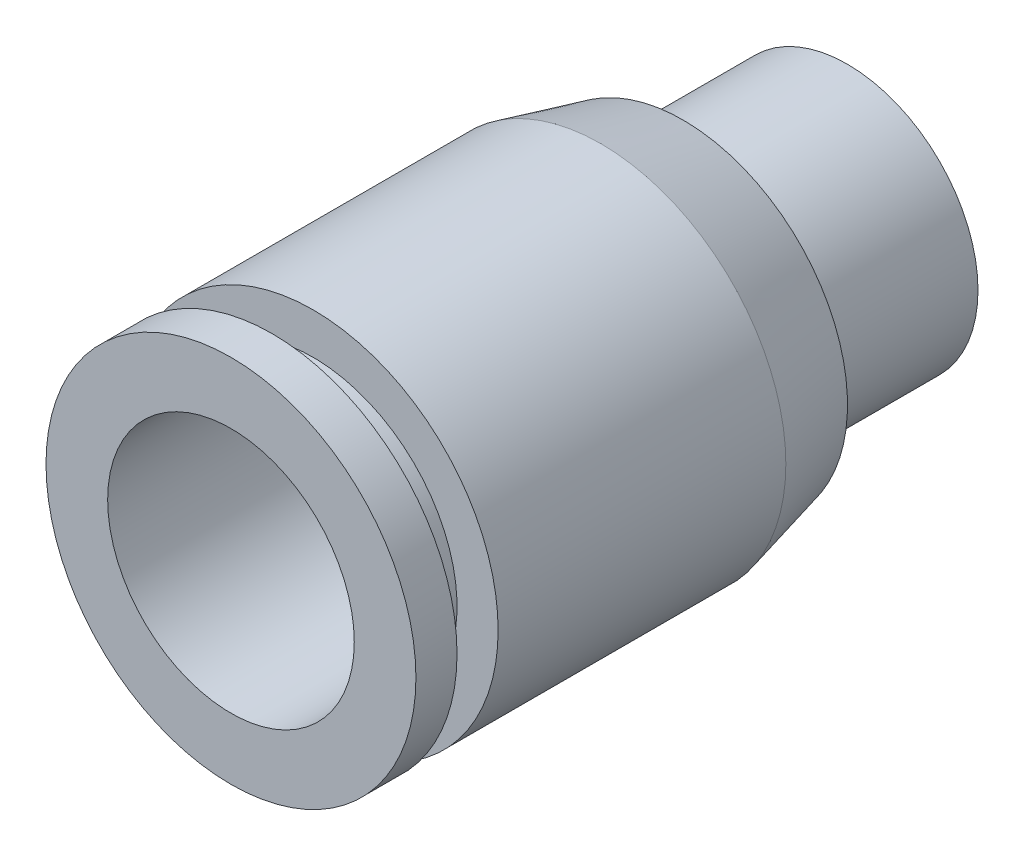
ISO-10303-21;
HEADER;
FILE_DESCRIPTION(('STEP AP214'),'2;1');
FILE_NAME('part.step','',(''),(''),'','','');
FILE_SCHEMA(('AUTOMOTIVE_DESIGN { 1 0 10303 214 1 1 1 1 }'));
ENDSEC;
DATA;
#1=APPLICATION_CONTEXT('core data for automotive mechanical design processes');
#2=APPLICATION_PROTOCOL_DEFINITION('international standard','automotive_design',2000,#1);
#3=PRODUCT_CONTEXT('',#1,'mechanical');
#4=PRODUCT('Part','Part','',(#3));
#5=PRODUCT_RELATED_PRODUCT_CATEGORY('part','',(#4));
#6=PRODUCT_DEFINITION_FORMATION('','',#4);
#7=PRODUCT_DEFINITION_CONTEXT('part definition',#1,'design');
#8=PRODUCT_DEFINITION('design','',#6,#7);
#9=PRODUCT_DEFINITION_SHAPE('','',#8);
#10=(LENGTH_UNIT() NAMED_UNIT(*) SI_UNIT(.MILLI.,.METRE.));
#11=(NAMED_UNIT(*) PLANE_ANGLE_UNIT() SI_UNIT($,.RADIAN.));
#12=(NAMED_UNIT(*) SI_UNIT($,.STERADIAN.) SOLID_ANGLE_UNIT());
#13=UNCERTAINTY_MEASURE_WITH_UNIT(LENGTH_MEASURE(1.E-05),#10,'distance_accuracy_value','');
#14=(GEOMETRIC_REPRESENTATION_CONTEXT(3) GLOBAL_UNCERTAINTY_ASSIGNED_CONTEXT((#13)) GLOBAL_UNIT_ASSIGNED_CONTEXT((#10,
#11,#12)) REPRESENTATION_CONTEXT('',''));
#15=CARTESIAN_POINT('',(0.,0.,0.));
#16=DIRECTION('',(0.,0.,1.));
#17=DIRECTION('',(1.,0.,0.));
#18=AXIS2_PLACEMENT_3D('',#15,#16,#17);
#19=CARTESIAN_POINT('',(0.,3.,2.));
#20=DIRECTION('',(0.,0.,1.));
#21=DIRECTION('',(1.,0.,0.));
#22=AXIS2_PLACEMENT_3D('',#19,#20,#21);
#23=PLANE('',#22);
#24=CARTESIAN_POINT('',(0.,0.,2.));
#25=DIRECTION('',(0.,0.,-1.));
#26=DIRECTION('',(-1.,0.,0.));
#27=AXIS2_PLACEMENT_3D('',#24,#25,#26);
#28=CIRCLE('',#27,2.);
#29=CARTESIAN_POINT('',(-2.,0.,2.));
#30=VERTEX_POINT('',#29);
#31=EDGE_CURVE('E10',#30,#30,#28,.T.);
#32=ORIENTED_EDGE('',*,*,#31,.T.);
#33=EDGE_LOOP('',(#32));
#34=FACE_BOUND('',#33,.T.);
#35=CARTESIAN_POINT('',(0.,0.,2.));
#36=DIRECTION('',(0.,0.,-1.));
#37=DIRECTION('',(-1.,0.,0.));
#38=AXIS2_PLACEMENT_3D('',#35,#36,#37);
#39=CIRCLE('',#38,3.);
#40=CARTESIAN_POINT('',(-3.,0.,2.));
#41=VERTEX_POINT('',#40);
#42=EDGE_CURVE('E72',#41,#41,#39,.T.);
#43=ORIENTED_EDGE('',*,*,#42,.F.);
#44=EDGE_LOOP('',(#43));
#45=FACE_BOUND('',#44,.T.);
#46=ADVANCED_FACE('F29',(#34,#45),#23,.T.);
#47=CARTESIAN_POINT('',(0.,0.,-4.7));
#48=DIRECTION('',(0.,0.,-1.));
#49=DIRECTION('',(-1.,0.,0.));
#50=AXIS2_PLACEMENT_3D('',#47,#48,#49);
#51=CYLINDRICAL_SURFACE('',#50,2.);
#52=CARTESIAN_POINT('',(0.,0.,-4.));
#53=DIRECTION('',(0.,0.,-1.));
#54=DIRECTION('',(-1.,0.,0.));
#55=AXIS2_PLACEMENT_3D('',#52,#53,#54);
#56=CIRCLE('',#55,2.);
#57=CARTESIAN_POINT('',(-2.,0.,-4.));
#58=VERTEX_POINT('',#57);
#59=EDGE_CURVE('E35',#58,#58,#56,.T.);
#60=ORIENTED_EDGE('',*,*,#59,.T.);
#61=EDGE_LOOP('',(#60));
#62=FACE_BOUND('',#61,.T.);
#63=ORIENTED_EDGE('',*,*,#31,.F.);
#64=EDGE_LOOP('',(#63));
#65=FACE_BOUND('',#64,.T.);
#66=ADVANCED_FACE('F80',(#62,#65),#51,.F.);
#67=CARTESIAN_POINT('',(0.,2.,-4.));
#68=DIRECTION('',(0.,0.,-1.));
#69=DIRECTION('',(-1.,0.,0.));
#70=AXIS2_PLACEMENT_3D('',#67,#68,#69);
#71=PLANE('',#70);
#72=CARTESIAN_POINT('',(0.,0.,-4.));
#73=DIRECTION('',(0.,0.,-1.));
#74=DIRECTION('',(-1.,0.,0.));
#75=AXIS2_PLACEMENT_3D('',#72,#73,#74);
#76=CIRCLE('',#75,3.175);
#77=CARTESIAN_POINT('',(-3.175,0.,-4.));
#78=VERTEX_POINT('',#77);
#79=EDGE_CURVE('E39',#78,#78,#76,.T.);
#80=ORIENTED_EDGE('',*,*,#79,.T.);
#81=EDGE_LOOP('',(#80));
#82=FACE_BOUND('',#81,.T.);
#83=ORIENTED_EDGE('',*,*,#59,.F.);
#84=EDGE_LOOP('',(#83));
#85=FACE_BOUND('',#84,.T.);
#86=ADVANCED_FACE('F84',(#82,#85),#71,.T.);
#87=CARTESIAN_POINT('',(0.,0.,-4.7));
#88=DIRECTION('',(0.,0.,-1.));
#89=DIRECTION('',(-1.,0.,0.));
#90=AXIS2_PLACEMENT_3D('',#87,#88,#89);
#91=CYLINDRICAL_SURFACE('',#90,3.175);
#92=CARTESIAN_POINT('',(0.,0.,0.));
#93=DIRECTION('',(0.,0.,-1.));
#94=DIRECTION('',(-1.,0.,0.));
#95=AXIS2_PLACEMENT_3D('',#92,#93,#94);
#96=CIRCLE('',#95,3.175);
#97=CARTESIAN_POINT('',(-3.175,0.,0.));
#98=VERTEX_POINT('',#97);
#99=EDGE_CURVE('E43',#98,#98,#96,.T.);
#100=ORIENTED_EDGE('',*,*,#99,.T.);
#101=EDGE_LOOP('',(#100));
#102=FACE_BOUND('',#101,.T.);
#103=ORIENTED_EDGE('',*,*,#79,.F.);
#104=EDGE_LOOP('',(#103));
#105=FACE_BOUND('',#104,.T.);
#106=ADVANCED_FACE('F88',(#102,#105),#91,.T.);
#107=CARTESIAN_POINT('',(0.,4.,0.));
#108=DIRECTION('',(0.,0.,-1.));
#109=DIRECTION('',(-1.,0.,0.));
#110=AXIS2_PLACEMENT_3D('',#107,#108,#109);
#111=PLANE('',#110);
#112=CARTESIAN_POINT('',(0.,0.,0.));
#113=DIRECTION('',(0.,0.,-1.));
#114=DIRECTION('',(-1.,0.,0.));
#115=AXIS2_PLACEMENT_3D('',#112,#113,#114);
#116=CIRCLE('',#115,4.);
#117=CARTESIAN_POINT('',(-4.,0.,0.));
#118=VERTEX_POINT('',#117);
#119=EDGE_CURVE('E48',#118,#118,#116,.T.);
#120=ORIENTED_EDGE('',*,*,#119,.T.);
#121=EDGE_LOOP('',(#120));
#122=FACE_BOUND('',#121,.T.);
#123=ORIENTED_EDGE('',*,*,#99,.F.);
#124=EDGE_LOOP('',(#123));
#125=FACE_BOUND('',#124,.T.);
#126=ADVANCED_FACE('F95',(#122,#125),#111,.T.);
#127=CARTESIAN_POINT('',(0.,0.,0.));
#128=DIRECTION('',(0.,0.,1.));
#129=DIRECTION('',(1.,0.,0.));
#130=AXIS2_PLACEMENT_3D('',#127,#128,#129);
#131=CONICAL_SURFACE('',#130,4.,0.244978663126864);
#132=CARTESIAN_POINT('',(0.,0.,2.));
#133=DIRECTION('',(0.,0.,-1.));
#134=DIRECTION('',(-1.,0.,0.));
#135=AXIS2_PLACEMENT_3D('',#132,#133,#134);
#136=CIRCLE('',#135,4.5);
#137=CARTESIAN_POINT('',(-4.5,0.,2.));
#138=VERTEX_POINT('',#137);
#139=EDGE_CURVE('E51',#138,#138,#136,.T.);
#140=ORIENTED_EDGE('',*,*,#139,.T.);
#141=EDGE_LOOP('',(#140));
#142=FACE_BOUND('',#141,.T.);
#143=ORIENTED_EDGE('',*,*,#119,.F.);
#144=EDGE_LOOP('',(#143));
#145=FACE_BOUND('',#144,.T.);
#146=ADVANCED_FACE('F99',(#142,#145),#131,.T.);
#147=CARTESIAN_POINT('',(0.,0.,-4.7));
#148=DIRECTION('',(0.,0.,-1.));
#149=DIRECTION('',(-1.,0.,0.));
#150=AXIS2_PLACEMENT_3D('',#147,#148,#149);
#151=CYLINDRICAL_SURFACE('',#150,4.5);
#152=CARTESIAN_POINT('',(0.,0.,9.));
#153=DIRECTION('',(0.,0.,-1.));
#154=DIRECTION('',(-1.,0.,0.));
#155=AXIS2_PLACEMENT_3D('',#152,#153,#154);
#156=CIRCLE('',#155,4.5);
#157=CARTESIAN_POINT('',(-4.5,0.,9.));
#158=VERTEX_POINT('',#157);
#159=EDGE_CURVE('E54',#158,#158,#156,.T.);
#160=ORIENTED_EDGE('',*,*,#159,.T.);
#161=EDGE_LOOP('',(#160));
#162=FACE_BOUND('',#161,.T.);
#163=ORIENTED_EDGE('',*,*,#139,.F.);
#164=EDGE_LOOP('',(#163));
#165=FACE_BOUND('',#164,.T.);
#166=ADVANCED_FACE('F103',(#162,#165),#151,.T.);
#167=CARTESIAN_POINT('',(0.,3.5,9.));
#168=DIRECTION('',(0.,0.,1.));
#169=DIRECTION('',(1.,0.,0.));
#170=AXIS2_PLACEMENT_3D('',#167,#168,#169);
#171=PLANE('',#170);
#172=CARTESIAN_POINT('',(0.,0.,9.));
#173=DIRECTION('',(0.,0.,-1.));
#174=DIRECTION('',(-1.,0.,0.));
#175=AXIS2_PLACEMENT_3D('',#172,#173,#174);
#176=CIRCLE('',#175,3.5);
#177=CARTESIAN_POINT('',(-3.5,0.,9.));
#178=VERTEX_POINT('',#177);
#179=EDGE_CURVE('E57',#178,#178,#176,.T.);
#180=ORIENTED_EDGE('',*,*,#179,.T.);
#181=EDGE_LOOP('',(#180));
#182=FACE_BOUND('',#181,.T.);
#183=ORIENTED_EDGE('',*,*,#159,.F.);
#184=EDGE_LOOP('',(#183));
#185=FACE_BOUND('',#184,.T.);
#186=ADVANCED_FACE('F107',(#182,#185),#171,.T.);
#187=CARTESIAN_POINT('',(0.,0.,-4.7));
#188=DIRECTION('',(0.,0.,-1.));
#189=DIRECTION('',(-1.,0.,0.));
#190=AXIS2_PLACEMENT_3D('',#187,#188,#189);
#191=CYLINDRICAL_SURFACE('',#190,3.5);
#192=CARTESIAN_POINT('',(0.,0.,10.));
#193=DIRECTION('',(0.,0.,-1.));
#194=DIRECTION('',(-1.,0.,0.));
#195=AXIS2_PLACEMENT_3D('',#192,#193,#194);
#196=CIRCLE('',#195,3.5);
#197=CARTESIAN_POINT('',(-3.5,0.,10.));
#198=VERTEX_POINT('',#197);
#199=EDGE_CURVE('E60',#198,#198,#196,.T.);
#200=ORIENTED_EDGE('',*,*,#199,.T.);
#201=EDGE_LOOP('',(#200));
#202=FACE_BOUND('',#201,.T.);
#203=ORIENTED_EDGE('',*,*,#179,.F.);
#204=EDGE_LOOP('',(#203));
#205=FACE_BOUND('',#204,.T.);
#206=ADVANCED_FACE('F111',(#202,#205),#191,.T.);
#207=CARTESIAN_POINT('',(0.,4.5,10.));
#208=DIRECTION('',(0.,0.,-1.));
#209=DIRECTION('',(-1.,0.,0.));
#210=AXIS2_PLACEMENT_3D('',#207,#208,#209);
#211=PLANE('',#210);
#212=CARTESIAN_POINT('',(0.,0.,10.));
#213=DIRECTION('',(0.,0.,-1.));
#214=DIRECTION('',(-1.,0.,0.));
#215=AXIS2_PLACEMENT_3D('',#212,#213,#214);
#216=CIRCLE('',#215,4.5);
#217=CARTESIAN_POINT('',(-4.5,0.,10.));
#218=VERTEX_POINT('',#217);
#219=EDGE_CURVE('E63',#218,#218,#216,.T.);
#220=ORIENTED_EDGE('',*,*,#219,.T.);
#221=EDGE_LOOP('',(#220));
#222=FACE_BOUND('',#221,.T.);
#223=ORIENTED_EDGE('',*,*,#199,.F.);
#224=EDGE_LOOP('',(#223));
#225=FACE_BOUND('',#224,.T.);
#226=ADVANCED_FACE('F115',(#222,#225),#211,.T.);
#227=CARTESIAN_POINT('',(0.,0.,-4.7));
#228=DIRECTION('',(0.,0.,-1.));
#229=DIRECTION('',(-1.,0.,0.));
#230=AXIS2_PLACEMENT_3D('',#227,#228,#229);
#231=CYLINDRICAL_SURFACE('',#230,4.5);
#232=CARTESIAN_POINT('',(0.,0.,11.));
#233=DIRECTION('',(0.,0.,-1.));
#234=DIRECTION('',(-1.,0.,0.));
#235=AXIS2_PLACEMENT_3D('',#232,#233,#234);
#236=CIRCLE('',#235,4.5);
#237=CARTESIAN_POINT('',(-4.5,0.,11.));
#238=VERTEX_POINT('',#237);
#239=EDGE_CURVE('E66',#238,#238,#236,.T.);
#240=ORIENTED_EDGE('',*,*,#239,.T.);
#241=EDGE_LOOP('',(#240));
#242=FACE_BOUND('',#241,.T.);
#243=ORIENTED_EDGE('',*,*,#219,.F.);
#244=EDGE_LOOP('',(#243));
#245=FACE_BOUND('',#244,.T.);
#246=ADVANCED_FACE('F119',(#242,#245),#231,.T.);
#247=CARTESIAN_POINT('',(0.,3.,11.));
#248=DIRECTION('',(0.,0.,1.));
#249=DIRECTION('',(1.,0.,0.));
#250=AXIS2_PLACEMENT_3D('',#247,#248,#249);
#251=PLANE('',#250);
#252=CARTESIAN_POINT('',(0.,0.,11.));
#253=DIRECTION('',(0.,0.,-1.));
#254=DIRECTION('',(-1.,0.,0.));
#255=AXIS2_PLACEMENT_3D('',#252,#253,#254);
#256=CIRCLE('',#255,3.);
#257=CARTESIAN_POINT('',(-3.,0.,11.));
#258=VERTEX_POINT('',#257);
#259=EDGE_CURVE('E69',#258,#258,#256,.T.);
#260=ORIENTED_EDGE('',*,*,#259,.T.);
#261=EDGE_LOOP('',(#260));
#262=FACE_BOUND('',#261,.T.);
#263=ORIENTED_EDGE('',*,*,#239,.F.);
#264=EDGE_LOOP('',(#263));
#265=FACE_BOUND('',#264,.T.);
#266=ADVANCED_FACE('F123',(#262,#265),#251,.T.);
#267=CARTESIAN_POINT('',(0.,0.,-4.7));
#268=DIRECTION('',(0.,0.,-1.));
#269=DIRECTION('',(-1.,0.,0.));
#270=AXIS2_PLACEMENT_3D('',#267,#268,#269);
#271=CYLINDRICAL_SURFACE('',#270,3.);
#272=ORIENTED_EDGE('',*,*,#42,.T.);
#273=EDGE_LOOP('',(#272));
#274=FACE_BOUND('',#273,.T.);
#275=ORIENTED_EDGE('',*,*,#259,.F.);
#276=EDGE_LOOP('',(#275));
#277=FACE_BOUND('',#276,.T.);
#278=ADVANCED_FACE('F76',(#274,#277),#271,.F.);
#279=CLOSED_SHELL('',(#46,#66,#86,#106,#126,#146,#166,#186,#206,#226,#246,#266,#278));
#280=MANIFOLD_SOLID_BREP('B2',#279);
#281=ADVANCED_BREP_SHAPE_REPRESENTATION('',(#18,#280),#14);
#282=SHAPE_DEFINITION_REPRESENTATION(#9,#281);
ENDSEC;
END-ISO-10303-21;
